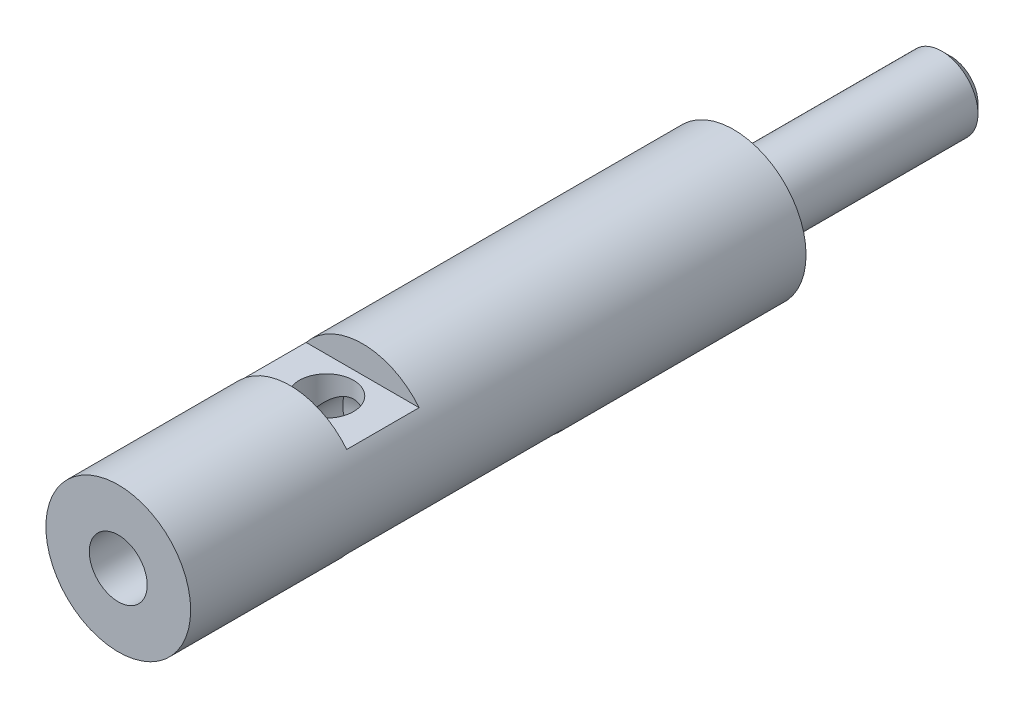
ISO-10303-21;
HEADER;
FILE_DESCRIPTION(('STEP AP214'),'2;1');
FILE_NAME('part.step','',(''),(''),'','','');
FILE_SCHEMA(('AUTOMOTIVE_DESIGN { 1 0 10303 214 1 1 1 1 }'));
ENDSEC;
DATA;
#1=APPLICATION_CONTEXT('core data for automotive mechanical design processes');
#2=APPLICATION_PROTOCOL_DEFINITION('international standard','automotive_design',2000,#1);
#3=PRODUCT_CONTEXT('',#1,'mechanical');
#4=PRODUCT('Part','Part','',(#3));
#5=PRODUCT_RELATED_PRODUCT_CATEGORY('part','',(#4));
#6=PRODUCT_DEFINITION_FORMATION('','',#4);
#7=PRODUCT_DEFINITION_CONTEXT('part definition',#1,'design');
#8=PRODUCT_DEFINITION('design','',#6,#7);
#9=PRODUCT_DEFINITION_SHAPE('','',#8);
#10=(LENGTH_UNIT() NAMED_UNIT(*) SI_UNIT(.MILLI.,.METRE.));
#11=(NAMED_UNIT(*) PLANE_ANGLE_UNIT() SI_UNIT($,.RADIAN.));
#12=(NAMED_UNIT(*) SI_UNIT($,.STERADIAN.) SOLID_ANGLE_UNIT());
#13=UNCERTAINTY_MEASURE_WITH_UNIT(LENGTH_MEASURE(1.E-05),#10,'distance_accuracy_value','');
#14=(GEOMETRIC_REPRESENTATION_CONTEXT(3) GLOBAL_UNCERTAINTY_ASSIGNED_CONTEXT((#13)) GLOBAL_UNIT_ASSIGNED_CONTEXT((#10,
#11,#12)) REPRESENTATION_CONTEXT('',''));
#15=CARTESIAN_POINT('',(0.,0.,0.));
#16=DIRECTION('',(0.,0.,1.));
#17=DIRECTION('',(1.,0.,0.));
#18=AXIS2_PLACEMENT_3D('',#15,#16,#17);
#19=CARTESIAN_POINT('',(0.,0.,-34.));
#20=DIRECTION('',(0.,0.,1.));
#21=DIRECTION('',(1.,0.,0.));
#22=AXIS2_PLACEMENT_3D('',#19,#20,#21);
#23=CYLINDRICAL_SURFACE('',#22,4.);
#24=CARTESIAN_POINT('',(0.,0.,-21.5));
#25=DIRECTION('',(0.,0.,-1.));
#26=DIRECTION('',(-1.,0.,0.));
#27=AXIS2_PLACEMENT_3D('',#24,#25,#26);
#28=CIRCLE('',#27,4.);
#29=CARTESIAN_POINT('',(-3.1224989991992,-2.5,-21.5));
#30=VERTEX_POINT('',#29);
#31=CARTESIAN_POINT('',(3.1224989991992,-2.5,-21.5));
#32=VERTEX_POINT('',#31);
#33=EDGE_CURVE('E101',#30,#32,#28,.F.);
#34=ORIENTED_EDGE('',*,*,#33,.F.);
#35=DIRECTION('',(0.,0.,1.));
#36=VECTOR('',#35,1.);
#37=CARTESIAN_POINT('',(-3.1224989991992,-2.5,-34.));
#38=LINE('',#37,#36);
#39=CARTESIAN_POINT('',(-3.1224989991992,-2.5,-9.5));
#40=VERTEX_POINT('',#39);
#41=EDGE_CURVE('E11',#30,#40,#38,.T.);
#42=ORIENTED_EDGE('',*,*,#41,.T.);
#43=CARTESIAN_POINT('',(0.,0.,-9.5));
#44=DIRECTION('',(0.,0.,-1.));
#45=DIRECTION('',(-1.,0.,0.));
#46=AXIS2_PLACEMENT_3D('',#43,#44,#45);
#47=CIRCLE('',#46,4.);
#48=CARTESIAN_POINT('',(3.1224989991992,-2.5,-9.5));
#49=VERTEX_POINT('',#48);
#50=EDGE_CURVE('E54',#40,#49,#47,.F.);
#51=ORIENTED_EDGE('',*,*,#50,.T.);
#52=DIRECTION('',(0.,0.,1.));
#53=VECTOR('',#52,1.);
#54=CARTESIAN_POINT('',(3.1224989991992,-2.5,-34.));
#55=LINE('',#54,#53);
#56=EDGE_CURVE('E151',#49,#32,#55,.F.);
#57=ORIENTED_EDGE('',*,*,#56,.T.);
#58=EDGE_LOOP('',(#34,#42,#51,#57));
#59=FACE_BOUND('',#58,.T.);
#60=CARTESIAN_POINT('',(0.,0.,-34.));
#61=DIRECTION('',(0.,0.,1.));
#62=DIRECTION('',(1.,0.,0.));
#63=AXIS2_PLACEMENT_3D('',#60,#61,#62);
#64=CIRCLE('',#63,4.);
#65=CARTESIAN_POINT('',(4.,0.,-34.));
#66=VERTEX_POINT('',#65);
#67=EDGE_CURVE('E131',#66,#66,#64,.T.);
#68=ORIENTED_EDGE('',*,*,#67,.T.);
#69=EDGE_LOOP('',(#68));
#70=FACE_BOUND('',#69,.T.);
#71=CARTESIAN_POINT('',(0.,0.,0.));
#72=DIRECTION('',(0.,0.,1.));
#73=DIRECTION('',(1.,0.,0.));
#74=AXIS2_PLACEMENT_3D('',#71,#72,#73);
#75=CIRCLE('',#74,4.);
#76=CARTESIAN_POINT('',(4.,0.,0.));
#77=VERTEX_POINT('',#76);
#78=EDGE_CURVE('E125',#77,#77,#75,.T.);
#79=ORIENTED_EDGE('',*,*,#78,.F.);
#80=EDGE_LOOP('',(#79));
#81=FACE_BOUND('',#80,.T.);
#82=CARTESIAN_POINT('',(0.,0.,-13.5));
#83=DIRECTION('',(0.,0.,1.));
#84=DIRECTION('',(1.,0.,0.));
#85=AXIS2_PLACEMENT_3D('',#82,#83,#84);
#86=CIRCLE('',#85,4.);
#87=CARTESIAN_POINT('',(-3.1224989991992,2.5,-13.5));
#88=VERTEX_POINT('',#87);
#89=CARTESIAN_POINT('',(3.1224989991992,2.5,-13.5));
#90=VERTEX_POINT('',#89);
#91=EDGE_CURVE('E89',#88,#90,#86,.F.);
#92=ORIENTED_EDGE('',*,*,#91,.T.);
#93=DIRECTION('',(0.,0.,1.));
#94=VECTOR('',#93,1.);
#95=CARTESIAN_POINT('',(3.1224989991992,2.5,-34.));
#96=LINE('',#95,#94);
#97=CARTESIAN_POINT('',(3.1224989991992,2.5,-9.5));
#98=VERTEX_POINT('',#97);
#99=EDGE_CURVE('E90',#98,#90,#96,.F.);
#100=ORIENTED_EDGE('',*,*,#99,.F.);
#101=CARTESIAN_POINT('',(0.,0.,-9.5));
#102=DIRECTION('',(0.,0.,1.));
#103=DIRECTION('',(0.,-1.,0.));
#104=AXIS2_PLACEMENT_3D('',#101,#102,#103);
#105=CIRCLE('',#104,4.);
#106=CARTESIAN_POINT('',(-3.1224989991992,2.5,-9.5));
#107=VERTEX_POINT('',#106);
#108=EDGE_CURVE('E94',#107,#98,#105,.F.);
#109=ORIENTED_EDGE('',*,*,#108,.F.);
#110=DIRECTION('',(0.,0.,1.));
#111=VECTOR('',#110,1.);
#112=CARTESIAN_POINT('',(-3.1224989991992,2.5,-34.));
#113=LINE('',#112,#111);
#114=EDGE_CURVE('E91',#88,#107,#113,.T.);
#115=ORIENTED_EDGE('',*,*,#114,.F.);
#116=EDGE_LOOP('',(#92,#100,#109,#115));
#117=FACE_BOUND('',#116,.T.);
#118=ADVANCED_FACE('F44',(#59,#70,#81,#117),#23,.T.);
#119=CARTESIAN_POINT('',(0.,0.,-34.));
#120=DIRECTION('',(0.,0.,1.));
#121=DIRECTION('',(1.,0.,0.));
#122=AXIS2_PLACEMENT_3D('',#119,#120,#121);
#123=PLANE('',#122);
#124=CARTESIAN_POINT('',(0.,0.,-34.));
#125=DIRECTION('',(0.,0.,-1.));
#126=DIRECTION('',(-1.,0.,0.));
#127=AXIS2_PLACEMENT_3D('',#124,#125,#126);
#128=CIRCLE('',#127,2.);
#129=CARTESIAN_POINT('',(-2.,0.,-34.));
#130=VERTEX_POINT('',#129);
#131=EDGE_CURVE('E126',#130,#130,#128,.T.);
#132=ORIENTED_EDGE('',*,*,#131,.F.);
#133=EDGE_LOOP('',(#132));
#134=FACE_BOUND('',#133,.T.);
#135=ORIENTED_EDGE('',*,*,#67,.F.);
#136=EDGE_LOOP('',(#135));
#137=FACE_BOUND('',#136,.T.);
#138=ADVANCED_FACE('F190',(#134,#137),#123,.F.);
#139=CARTESIAN_POINT('',(0.,0.,0.));
#140=DIRECTION('',(0.,0.,1.));
#141=DIRECTION('',(1.,0.,0.));
#142=AXIS2_PLACEMENT_3D('',#139,#140,#141);
#143=PLANE('',#142);
#144=CARTESIAN_POINT('',(0.,0.,0.));
#145=DIRECTION('',(0.,0.,1.));
#146=DIRECTION('',(1.,0.,0.));
#147=AXIS2_PLACEMENT_3D('',#144,#145,#146);
#148=CIRCLE('',#147,1.59999999999999);
#149=CARTESIAN_POINT('',(1.59999999999999,0.,0.));
#150=VERTEX_POINT('',#149);
#151=EDGE_CURVE('E116',#150,#150,#148,.T.);
#152=ORIENTED_EDGE('',*,*,#151,.F.);
#153=EDGE_LOOP('',(#152));
#154=FACE_BOUND('',#153,.T.);
#155=ORIENTED_EDGE('',*,*,#78,.T.);
#156=EDGE_LOOP('',(#155));
#157=FACE_BOUND('',#156,.T.);
#158=ADVANCED_FACE('F194',(#154,#157),#143,.T.);
#159=CARTESIAN_POINT('',(0.,0.,-46.));
#160=DIRECTION('',(0.,0.,1.));
#161=DIRECTION('',(1.,0.,0.));
#162=AXIS2_PLACEMENT_3D('',#159,#160,#161);
#163=CYLINDRICAL_SURFACE('',#162,2.);
#164=CARTESIAN_POINT('',(0.,0.,-45.5));
#165=DIRECTION('',(0.,0.,-1.));
#166=DIRECTION('',(-1.,0.,0.));
#167=AXIS2_PLACEMENT_3D('',#164,#165,#166);
#168=CIRCLE('',#167,2.);
#169=CARTESIAN_POINT('',(-2.,0.,-45.5));
#170=VERTEX_POINT('',#169);
#171=EDGE_CURVE('E141',#170,#170,#168,.F.);
#172=ORIENTED_EDGE('',*,*,#171,.T.);
#173=EDGE_LOOP('',(#172));
#174=FACE_BOUND('',#173,.T.);
#175=ORIENTED_EDGE('',*,*,#131,.T.);
#176=EDGE_LOOP('',(#175));
#177=FACE_BOUND('',#176,.T.);
#178=ADVANCED_FACE('F199',(#174,#177),#163,.T.);
#179=CARTESIAN_POINT('',(0.,0.,-46.));
#180=DIRECTION('',(0.,0.,-1.));
#181=DIRECTION('',(-1.,0.,0.));
#182=AXIS2_PLACEMENT_3D('',#179,#180,#181);
#183=PLANE('',#182);
#184=CARTESIAN_POINT('',(0.,0.,-46.));
#185=DIRECTION('',(0.,0.,-1.));
#186=DIRECTION('',(-1.,0.,0.));
#187=AXIS2_PLACEMENT_3D('',#184,#185,#186);
#188=CIRCLE('',#187,1.5);
#189=CARTESIAN_POINT('',(-1.5,0.,-46.));
#190=VERTEX_POINT('',#189);
#191=EDGE_CURVE('E130',#190,#190,#188,.T.);
#192=ORIENTED_EDGE('',*,*,#191,.T.);
#193=EDGE_LOOP('',(#192));
#194=FACE_BOUND('',#193,.T.);
#195=ADVANCED_FACE('F204',(#194),#183,.T.);
#196=CARTESIAN_POINT('',(0.,0.,-46.));
#197=DIRECTION('',(0.,0.,1.));
#198=DIRECTION('',(1.,0.,0.));
#199=AXIS2_PLACEMENT_3D('',#196,#197,#198);
#200=CONICAL_SURFACE('',#199,1.5,0.78539816339744);
#201=ORIENTED_EDGE('',*,*,#171,.F.);
#202=EDGE_LOOP('',(#201));
#203=FACE_BOUND('',#202,.T.);
#204=ORIENTED_EDGE('',*,*,#191,.F.);
#205=EDGE_LOOP('',(#204));
#206=FACE_BOUND('',#205,.T.);
#207=ADVANCED_FACE('F47',(#203,#206),#200,.T.);
#208=CARTESIAN_POINT('',(0.,0.,-14.));
#209=DIRECTION('',(0.,0.,1.));
#210=DIRECTION('',(1.,0.,0.));
#211=AXIS2_PLACEMENT_3D('',#208,#209,#210);
#212=CONICAL_SURFACE('',#211,1.6,1.02974425867665);
#213=CARTESIAN_POINT('',(0.,0.,-14.9613769904441));
#214=VERTEX_POINT('',#213);
#215=VERTEX_LOOP('',#214);
#216=FACE_BOUND('',#215,.T.);
#217=CARTESIAN_POINT('',(0.,0.,-14.));
#218=DIRECTION('',(0.,0.,1.));
#219=DIRECTION('',(1.,0.,0.));
#220=AXIS2_PLACEMENT_3D('',#217,#218,#219);
#221=CIRCLE('',#220,1.6);
#222=CARTESIAN_POINT('',(1.6,0.,-14.));
#223=VERTEX_POINT('',#222);
#224=EDGE_CURVE('E120',#223,#223,#221,.T.);
#225=ORIENTED_EDGE('',*,*,#224,.T.);
#226=EDGE_LOOP('',(#225));
#227=FACE_BOUND('',#226,.T.);
#228=ADVANCED_FACE('F209',(#216,#227),#212,.F.);
#229=CARTESIAN_POINT('',(0.,0.,0.));
#230=DIRECTION('',(0.,0.,1.));
#231=DIRECTION('',(1.,0.,0.));
#232=AXIS2_PLACEMENT_3D('',#229,#230,#231);
#233=CYLINDRICAL_SURFACE('',#232,1.59999999999999);
#234=CARTESIAN_POINT('',(0.,1.59999999999999,-10.));
#235=CARTESIAN_POINT('',(0.0684255819523124,1.59999100993067,-10.0000090962978));
#236=CARTESIAN_POINT('',(0.136969761419659,1.59556467819543,-10.0047281971338));
#237=CARTESIAN_POINT('',(0.271820864103849,1.57821703920185,-10.0232539049869));
#238=CARTESIAN_POINT('',(0.338120531372212,1.56527051953187,-10.0370874831407));
#239=CARTESIAN_POINT('',(0.466029039157558,1.53204181361779,-10.0726973534836));
#240=CARTESIAN_POINT('',(0.527667983699462,1.51181264687308,-10.0944162480474));
#241=CARTESIAN_POINT('',(0.645624057326148,1.46533125031908,-10.1445358019232));
#242=CARTESIAN_POINT('',(0.701942648568488,1.43908068217026,-10.172934617905));
#243=CARTESIAN_POINT('',(0.830488511004104,1.37023549959972,-10.2478632281665));
#244=CARTESIAN_POINT('',(0.899909356040595,1.32532924968791,-10.2970760172881));
#245=CARTESIAN_POINT('',(1.02730053831725,1.22924745848653,-10.4038236725768));
#246=CARTESIAN_POINT('',(1.08523092595497,1.17805101301526,-10.4613864091608));
#247=CARTESIAN_POINT('',(1.17078105057247,1.09156202300322,-10.560920796247));
#248=CARTESIAN_POINT('',(1.20175833727903,1.05726375119173,-10.6009408086179));
#249=CARTESIAN_POINT('',(1.25930890566738,0.988010810145918,-10.6834986333498));
#250=CARTESIAN_POINT('',(1.28588281199331,0.953056234796474,-10.7260360874337));
#251=CARTESIAN_POINT('',(1.33467012957743,0.883435608136694,-10.8135864668672));
#252=CARTESIAN_POINT('',(1.35689236994422,0.848769112188215,-10.8585941376334));
#253=CARTESIAN_POINT('',(1.3970362278902,0.780917148192494,-10.9514994512178));
#254=CARTESIAN_POINT('',(1.4149635108398,0.747729776660347,-10.9993931815076));
#255=CARTESIAN_POINT('',(1.44158488802393,0.694574099514458,-11.0838822859475));
#256=CARTESIAN_POINT('',(1.45143080990949,0.673647073701061,-11.1195046105091));
#257=CARTESIAN_POINT('',(1.46874054388632,0.635016088570958,-11.1930368336448));
#258=CARTESIAN_POINT('',(1.47620697945579,0.617308588918451,-11.2309441576764));
#259=CARTESIAN_POINT('',(1.48710185280875,0.590503680558253,-11.3012201572755));
#260=CARTESIAN_POINT('',(1.49104694938892,0.580381760051782,-11.3331032235742));
#261=CARTESIAN_POINT('',(1.49689488628612,0.565132788162447,-11.3981894510155));
#262=CARTESIAN_POINT('',(1.49880415766172,0.55999001270232,-11.4313881095201));
#263=CARTESIAN_POINT('',(1.50037685312532,0.55576681639676,-11.4985170672047));
#264=CARTESIAN_POINT('',(1.50002232907756,0.556734843369683,-11.5324510822661));
#265=CARTESIAN_POINT('',(1.49707243273785,0.564613886898902,-11.5995451956431));
#266=CARTESIAN_POINT('',(1.4944718971692,0.57153859691651,-11.6327033297862));
#267=CARTESIAN_POINT('',(1.48583868780731,0.593691355415249,-11.7107065522608));
#268=CARTESIAN_POINT('',(1.47883660489909,0.611158481279116,-11.7547767608288));
#269=CARTESIAN_POINT('',(1.46163501869308,0.651230780563993,-11.8398884700143));
#270=CARTESIAN_POINT('',(1.45142140048049,0.673858512219675,-11.8809155928408));
#271=CARTESIAN_POINT('',(1.42705633043943,0.724130291338584,-11.964295134449));
#272=CARTESIAN_POINT('',(1.41262082836606,0.752047417768079,-12.0063961883062));
#273=CARTESIAN_POINT('',(1.38053670392535,0.809448984794793,-12.0882594625083));
#274=CARTESIAN_POINT('',(1.36288484352601,0.838934983462925,-12.1280192719695));
#275=CARTESIAN_POINT('',(1.30513055308311,0.92824653293198,-12.2444222286512));
#276=CARTESIAN_POINT('',(1.26024681474812,0.988886891758765,-12.3181312163075));
#277=CARTESIAN_POINT('',(1.1522222614889,1.11350800341082,-12.4651426434821));
#278=CARTESIAN_POINT('',(1.08770668085878,1.1772183796024,-12.5376707660719));
#279=CARTESIAN_POINT('',(0.941971511717638,1.29672721862756,-12.6714935311562));
#280=CARTESIAN_POINT('',(0.86081512421694,1.35255430540364,-12.7328290638758));
#281=CARTESIAN_POINT('',(0.715544871064898,1.43250376355302,-12.8199381988512));
#282=CARTESIAN_POINT('',(0.656464639142318,1.46066194156335,-12.8504193629851));
#283=CARTESIAN_POINT('',(0.532380202594975,1.51030557076395,-12.9039676752676));
#284=CARTESIAN_POINT('',(0.467379935912651,1.5317954163251,-12.9270397063193));
#285=CARTESIAN_POINT('',(0.332158679533457,1.56671039192709,-12.964454412966));
#286=CARTESIAN_POINT('',(0.261898429302673,1.58006627656504,-12.9787221497356));
#287=CARTESIAN_POINT('',(0.118916949535154,1.59719349756616,-12.9970096377307));
#288=CARTESIAN_POINT('',(0.0461977442778849,1.60097253214485,-13.0010376200461));
#289=CARTESIAN_POINT('',(-0.0898241742949339,1.5987422645432,-12.9986581904231));
#290=CARTESIAN_POINT('',(-0.153173912852336,1.59389115980747,-12.9934855518758));
#291=CARTESIAN_POINT('',(-0.277753685333681,1.57696068243675,-12.975403365772));
#292=CARTESIAN_POINT('',(-0.338983446812124,1.56488038437404,-12.9624928276668));
#293=CARTESIAN_POINT('',(-0.457735986419073,1.53435147837037,-12.9297793136347));
#294=CARTESIAN_POINT('',(-0.515265285072301,1.51591445776733,-12.9099888781736));
#295=CARTESIAN_POINT('',(-0.625826321394376,1.47371929048371,-12.8645218804443));
#296=CARTESIAN_POINT('',(-0.678856869780208,1.44995974275386,-12.8388437683204));
#297=CARTESIAN_POINT('',(-0.804323666257103,1.38569203947423,-12.7690194645366));
#298=CARTESIAN_POINT('',(-0.873816485374865,1.34262645456978,-12.7219326921356));
#299=CARTESIAN_POINT('',(-1.00176463057465,1.25009328041173,-12.6194762183997));
#300=CARTESIAN_POINT('',(-1.06018192297003,1.20060457993999,-12.5640791050474));
#301=CARTESIAN_POINT('',(-1.14747741148049,1.11605538641916,-12.4674270647179));
#302=CARTESIAN_POINT('',(-1.17951966582665,1.08204019580845,-12.4280484924892));
#303=CARTESIAN_POINT('',(-1.23917518469032,1.01317225735416,-12.3467515587635));
#304=CARTESIAN_POINT('',(-1.26678887424384,0.978319590257875,-12.3048334415346));
#305=CARTESIAN_POINT('',(-1.31764191463907,0.908666765165572,-12.218556692848));
#306=CARTESIAN_POINT('',(-1.34088972001461,0.873866637883983,-12.1742029978392));
#307=CARTESIAN_POINT('',(-1.38309994332714,0.805383294233538,-12.0827298984665));
#308=CARTESIAN_POINT('',(-1.40206704077596,0.771698892914992,-12.0356135858014));
#309=CARTESIAN_POINT('',(-1.43080243256963,0.716573830570109,-11.9518434003516));
#310=CARTESIAN_POINT('',(-1.44164985062665,0.694387989717438,-11.9160542008122));
#311=CARTESIAN_POINT('',(-1.46094173101544,0.652817311175955,-11.842208361234));
#312=CARTESIAN_POINT('',(-1.46938663186735,0.633431962644846,-11.8041521365202));
#313=CARTESIAN_POINT('',(-1.48226072963674,0.602605017567066,-11.7323453147986));
#314=CARTESIAN_POINT('',(-1.4871367841298,0.590364021627845,-11.6990307214481));
#315=CARTESIAN_POINT('',(-1.49468197065955,0.570995915270092,-11.6307524923585));
#316=CARTESIAN_POINT('',(-1.49735937115688,0.563849658605719,-11.5957955624773));
#317=CARTESIAN_POINT('',(-1.50022554535816,0.556188195946332,-11.5245568122864));
#318=CARTESIAN_POINT('',(-1.50038283453941,0.555756883688066,-11.488263900227));
#319=CARTESIAN_POINT('',(-1.49809981486309,0.561875339118336,-11.4163325816119));
#320=CARTESIAN_POINT('',(-1.49565398700772,0.568439939227102,-11.380695729265));
#321=CARTESIAN_POINT('',(-1.48749788637684,0.589493082818556,-11.3016563649174));
#322=CARTESIAN_POINT('',(-1.48107662983667,0.60566027751303,-11.2588024446772));
#323=CARTESIAN_POINT('',(-1.46519284514556,0.64313762011683,-11.175957538847));
#324=CARTESIAN_POINT('',(-1.45571686428683,0.664470411421141,-11.1359801921781));
#325=CARTESIAN_POINT('',(-1.43308878736763,0.71204969388331,-11.0548129753519));
#326=CARTESIAN_POINT('',(-1.41967554469701,0.73856925072948,-11.0138601198266));
#327=CARTESIAN_POINT('',(-1.38985030146091,0.79328078577116,-10.9342061780958));
#328=CARTESIAN_POINT('',(-1.37343521142804,0.821474466580534,-10.8955074664367));
#329=CARTESIAN_POINT('',(-1.31974256303736,0.907082200617741,-10.7821589547871));
#330=CARTESIAN_POINT('',(-1.2780328332995,0.96548843999582,-10.7103094131892));
#331=CARTESIAN_POINT('',(-1.17693332909144,1.08712656870906,-10.5653838564812));
#332=CARTESIAN_POINT('',(-1.11604484000421,1.15012229053256,-10.4931500874728));
#333=CARTESIAN_POINT('',(-0.978384321159548,1.2692509206159,-10.3589749614361));
#334=CARTESIAN_POINT('',(-0.901663440053412,1.32540502482404,-10.2970015909359));
#335=CARTESIAN_POINT('',(-0.761516551758954,1.408636613547,-10.2059900545818));
#336=CARTESIAN_POINT('',(-0.70265613942213,1.43905674895607,-10.1729707472108));
#337=CARTESIAN_POINT('',(-0.578477152845028,1.49329683004649,-10.1143373223451));
#338=CARTESIAN_POINT('',(-0.513162974258361,1.51712122660306,-10.0887182106105));
#339=CARTESIAN_POINT('',(-0.386200408140212,1.55390938239855,-10.0492492504271));
#340=CARTESIAN_POINT('',(-0.325189090831689,1.56788580592606,-10.0342986233955));
#341=CARTESIAN_POINT('',(-0.200670425393347,1.58861097203542,-10.0121489553886));
#342=CARTESIAN_POINT('',(-0.13717048781783,1.59537969972829,-10.0049284803625));
#343=CARTESIAN_POINT('',(-0.0489577110307275,1.59944074803712,-10.0005966544392));
#344=CARTESIAN_POINT('',(-0.0244864493340522,1.60000321714292,-9.99999674484265));
#345=CARTESIAN_POINT('',(0.,1.59999999999999,-10.));
#346=B_SPLINE_CURVE_WITH_KNOTS('',3,(#234,#235,#236,#237,#238,#239,#240,#241,#242,#243,#244,
#245,#246,#247,#248,#249,#250,#251,#252,#253,#254,#255,#256,#257,#258,#259,#260,#261,#262,#263,
#264,#265,#266,#267,#268,#269,#270,#271,#272,#273,#274,#275,#276,#277,#278,#279,#280,#281,#282,
#283,#284,#285,#286,#287,#288,#289,#290,#291,#292,#293,#294,#295,#296,#297,#298,#299,#300,#301,
#302,#303,#304,#305,#306,#307,#308,#309,#310,#311,#312,#313,#314,#315,#316,#317,#318,#319,#320,
#321,#322,#323,#324,#325,#326,#327,#328,#329,#330,#331,#332,#333,#334,#335,#336,#337,#338,#339,
#340,#341,#342,#343,#344,#345),.UNSPECIFIED.,.T.,.F.,(4,2,2,2,2,2,2,2,2,2,2,2,2,2,2,2,2,2,2,2,2,
2,2,2,2,2,2,2,2,2,2,2,2,2,2,2,2,2,2,2,2,2,2,2,2,2,2,2,2,2,2,2,2,2,2,4),(0.,0.205191194350401,
0.410992324539083,0.615324504475547,0.819600364781852,1.10668891633045,1.39475875441688,
1.57797159708169,1.76115842768929,1.94396964900547,2.1265383843133,2.25379522043879,
2.38091126151401,2.48161669197437,2.58200304846303,2.68318628478435,2.78460274869496,
2.92755182236974,3.07113816175826,3.22851946560473,3.38606009559672,3.70135424338245,
4.04810638258295,4.39356518751198,4.60938269160768,4.8250576703877,5.0425439470359,
5.25985534488229,5.45015751158169,5.64048404456582,5.83046545960808,6.02049694236049,
6.30198386380245,6.58442057318485,6.76754781754565,6.95065747555074,7.1334088004348,
7.31595937010021,7.44626722225468,7.57655127464998,7.68369231421017,7.79042855986851,
7.89849726875139,8.00679555674798,8.14477595318693,8.28337249894483,8.43494757827371,
8.58667954401141,8.89033594061586,9.22956287389841,9.56771058052488,9.78902158846352,
10.0101828873086,10.2024308125783,10.3941442839537,10.4675730169056),.UNSPECIFIED.);
#347=CARTESIAN_POINT('',(0.,1.59999999999999,-10.));
#348=VERTEX_POINT('',#347);
#349=EDGE_CURVE('E105',#348,#348,#346,.T.);
#350=ORIENTED_EDGE('',*,*,#349,.T.);
#351=EDGE_LOOP('',(#350));
#352=FACE_BOUND('',#351,.T.);
#353=ORIENTED_EDGE('',*,*,#224,.F.);
#354=EDGE_LOOP('',(#353));
#355=FACE_BOUND('',#354,.T.);
#356=ORIENTED_EDGE('',*,*,#151,.T.);
#357=EDGE_LOOP('',(#356));
#358=FACE_BOUND('',#357,.T.);
#359=ADVANCED_FACE('F212',(#352,#355,#358),#233,.F.);
#360=CARTESIAN_POINT('',(-4.,4.,-9.5));
#361=DIRECTION('',(0.,0.,1.));
#362=DIRECTION('',(0.,-1.,0.));
#363=AXIS2_PLACEMENT_3D('',#360,#361,#362);
#364=PLANE('',#363);
#365=DIRECTION('',(1.,0.,0.));
#366=VECTOR('',#365,1.);
#367=CARTESIAN_POINT('',(-4.,2.5,-9.5));
#368=LINE('',#367,#366);
#369=EDGE_CURVE('E99',#107,#98,#368,.T.);
#370=ORIENTED_EDGE('',*,*,#369,.F.);
#371=ORIENTED_EDGE('',*,*,#108,.T.);
#372=EDGE_LOOP('',(#370,#371));
#373=FACE_BOUND('',#372,.T.);
#374=ADVANCED_FACE('F215',(#373),#364,.F.);
#375=CARTESIAN_POINT('',(-4.,4.,-13.5));
#376=DIRECTION('',(0.,0.,1.));
#377=DIRECTION('',(1.,0.,0.));
#378=AXIS2_PLACEMENT_3D('',#375,#376,#377);
#379=PLANE('',#378);
#380=DIRECTION('',(1.,0.,0.));
#381=VECTOR('',#380,1.);
#382=CARTESIAN_POINT('',(-4.,2.5,-13.5));
#383=LINE('',#382,#381);
#384=EDGE_CURVE('E61',#88,#90,#383,.T.);
#385=ORIENTED_EDGE('',*,*,#384,.T.);
#386=ORIENTED_EDGE('',*,*,#91,.F.);
#387=EDGE_LOOP('',(#385,#386));
#388=FACE_BOUND('',#387,.T.);
#389=ADVANCED_FACE('F103',(#388),#379,.T.);
#390=CARTESIAN_POINT('',(-4.,2.5,-9.5));
#391=DIRECTION('',(0.,-1.,0.));
#392=DIRECTION('',(0.,0.,-1.));
#393=AXIS2_PLACEMENT_3D('',#390,#391,#392);
#394=PLANE('',#393);
#395=CARTESIAN_POINT('',(0.,2.5,-11.5));
#396=DIRECTION('',(0.,1.,0.));
#397=DIRECTION('',(0.,0.,1.));
#398=AXIS2_PLACEMENT_3D('',#395,#396,#397);
#399=CIRCLE('',#398,1.49999999999999);
#400=CARTESIAN_POINT('',(0.,2.5,-10.));
#401=VERTEX_POINT('',#400);
#402=EDGE_CURVE('E112',#401,#401,#399,.T.);
#403=ORIENTED_EDGE('',*,*,#402,.F.);
#404=EDGE_LOOP('',(#403));
#405=FACE_BOUND('',#404,.T.);
#406=ORIENTED_EDGE('',*,*,#99,.T.);
#407=ORIENTED_EDGE('',*,*,#384,.F.);
#408=ORIENTED_EDGE('',*,*,#114,.T.);
#409=ORIENTED_EDGE('',*,*,#369,.T.);
#410=EDGE_LOOP('',(#406,#407,#408,#409));
#411=FACE_BOUND('',#410,.T.);
#412=ADVANCED_FACE('F97',(#405,#411),#394,.F.);
#413=CARTESIAN_POINT('',(-4.,-4.,-9.5));
#414=DIRECTION('',(0.,0.,-1.));
#415=DIRECTION('',(-1.,0.,0.));
#416=AXIS2_PLACEMENT_3D('',#413,#414,#415);
#417=PLANE('',#416);
#418=DIRECTION('',(1.,0.,0.));
#419=VECTOR('',#418,1.);
#420=CARTESIAN_POINT('',(-4.,-2.5,-9.5));
#421=LINE('',#420,#419);
#422=EDGE_CURVE('E121',#40,#49,#421,.T.);
#423=ORIENTED_EDGE('',*,*,#422,.T.);
#424=ORIENTED_EDGE('',*,*,#50,.F.);
#425=EDGE_LOOP('',(#423,#424));
#426=FACE_BOUND('',#425,.T.);
#427=ADVANCED_FACE('F162',(#426),#417,.T.);
#428=CARTESIAN_POINT('',(-4.,-2.5,-9.5));
#429=DIRECTION('',(0.,-1.,0.));
#430=DIRECTION('',(0.,0.,-1.));
#431=AXIS2_PLACEMENT_3D('',#428,#429,#430);
#432=PLANE('',#431);
#433=ORIENTED_EDGE('',*,*,#422,.F.);
#434=ORIENTED_EDGE('',*,*,#41,.F.);
#435=DIRECTION('',(1.,0.,0.));
#436=VECTOR('',#435,1.);
#437=CARTESIAN_POINT('',(-4.,-2.5,-21.5));
#438=LINE('',#437,#436);
#439=EDGE_CURVE('E109',#30,#32,#438,.T.);
#440=ORIENTED_EDGE('',*,*,#439,.T.);
#441=ORIENTED_EDGE('',*,*,#56,.F.);
#442=EDGE_LOOP('',(#433,#434,#440,#441));
#443=FACE_BOUND('',#442,.T.);
#444=ADVANCED_FACE('F164',(#443),#432,.T.);
#445=CARTESIAN_POINT('',(-4.,-4.,-21.5));
#446=DIRECTION('',(0.,0.,-1.));
#447=DIRECTION('',(-1.,0.,0.));
#448=AXIS2_PLACEMENT_3D('',#445,#446,#447);
#449=PLANE('',#448);
#450=ORIENTED_EDGE('',*,*,#439,.F.);
#451=ORIENTED_EDGE('',*,*,#33,.T.);
#452=EDGE_LOOP('',(#450,#451));
#453=FACE_BOUND('',#452,.T.);
#454=ADVANCED_FACE('F181',(#453),#449,.F.);
#455=CARTESIAN_POINT('',(0.,2.5,-11.5));
#456=DIRECTION('',(0.,1.,0.));
#457=DIRECTION('',(0.,0.,1.));
#458=AXIS2_PLACEMENT_3D('',#455,#456,#457);
#459=CYLINDRICAL_SURFACE('',#458,1.49999999999999);
#460=ORIENTED_EDGE('',*,*,#349,.F.);
#461=EDGE_LOOP('',(#460));
#462=FACE_BOUND('',#461,.T.);
#463=ORIENTED_EDGE('',*,*,#402,.T.);
#464=EDGE_LOOP('',(#463));
#465=FACE_BOUND('',#464,.T.);
#466=ADVANCED_FACE('F178',(#462,#465),#459,.F.);
#467=CLOSED_SHELL('',(#118,#138,#158,#178,#195,#207,#228,#359,#374,#389,#412,#427,#444,#454,#466));
#468=MANIFOLD_SOLID_BREP('B2',#467);
#469=ADVANCED_BREP_SHAPE_REPRESENTATION('',(#18,#468),#14);
#470=SHAPE_DEFINITION_REPRESENTATION(#9,#469);
ENDSEC;
END-ISO-10303-21;
